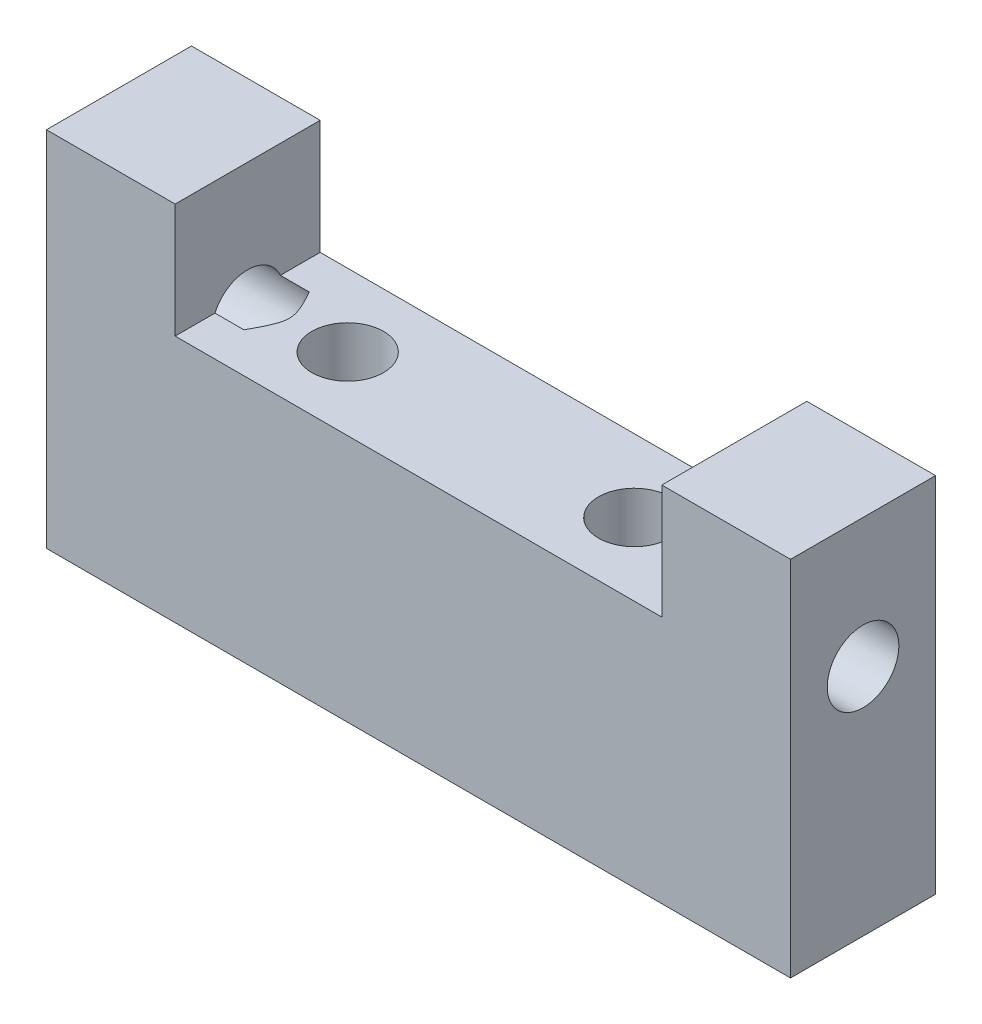
ISO-10303-21;
HEADER;
FILE_DESCRIPTION(('STEP AP214'),'2;1');
FILE_NAME('part.step','',(''),(''),'','','');
FILE_SCHEMA(('AUTOMOTIVE_DESIGN { 1 0 10303 214 1 1 1 1 }'));
ENDSEC;
DATA;
#1=APPLICATION_CONTEXT('core data for automotive mechanical design processes');
#2=APPLICATION_PROTOCOL_DEFINITION('international standard','automotive_design',2000,#1);
#3=PRODUCT_CONTEXT('',#1,'mechanical');
#4=PRODUCT('Part','Part','',(#3));
#5=PRODUCT_RELATED_PRODUCT_CATEGORY('part','',(#4));
#6=PRODUCT_DEFINITION_FORMATION('','',#4);
#7=PRODUCT_DEFINITION_CONTEXT('part definition',#1,'design');
#8=PRODUCT_DEFINITION('design','',#6,#7);
#9=PRODUCT_DEFINITION_SHAPE('','',#8);
#10=(LENGTH_UNIT() NAMED_UNIT(*) SI_UNIT(.MILLI.,.METRE.));
#11=(NAMED_UNIT(*) PLANE_ANGLE_UNIT() SI_UNIT($,.RADIAN.));
#12=(NAMED_UNIT(*) SI_UNIT($,.STERADIAN.) SOLID_ANGLE_UNIT());
#13=UNCERTAINTY_MEASURE_WITH_UNIT(LENGTH_MEASURE(1.E-05),#10,'distance_accuracy_value','');
#14=(GEOMETRIC_REPRESENTATION_CONTEXT(3) GLOBAL_UNCERTAINTY_ASSIGNED_CONTEXT((#13)) GLOBAL_UNIT_ASSIGNED_CONTEXT((#10,
#11,#12)) REPRESENTATION_CONTEXT('',''));
#15=CARTESIAN_POINT('',(0.,0.,0.));
#16=DIRECTION('',(0.,0.,1.));
#17=DIRECTION('',(1.,0.,0.));
#18=AXIS2_PLACEMENT_3D('',#15,#16,#17);
#19=CARTESIAN_POINT('',(-12.98,6.325,-5.06));
#20=DIRECTION('',(0.,1.,0.));
#21=DIRECTION('',(0.,0.,1.));
#22=AXIS2_PLACEMENT_3D('',#19,#20,#21);
#23=PLANE('',#22);
#24=DIRECTION('',(-1.,0.,0.));
#25=VECTOR('',#24,1.);
#26=CARTESIAN_POINT('',(-12.98,6.325,-5.06));
#27=LINE('',#26,#25);
#28=CARTESIAN_POINT('',(12.98,6.325,-5.06));
#29=VERTEX_POINT('',#28);
#30=CARTESIAN_POINT('',(8.49,6.325,-5.06));
#31=VERTEX_POINT('',#30);
#32=EDGE_CURVE('E185',#29,#31,#27,.T.);
#33=ORIENTED_EDGE('',*,*,#32,.T.);
#34=DIRECTION('',(0.,0.,1.));
#35=VECTOR('',#34,1.);
#36=CARTESIAN_POINT('',(8.49,6.325,-5.06));
#37=LINE('',#36,#35);
#38=CARTESIAN_POINT('',(8.49,6.325,0.));
#39=VERTEX_POINT('',#38);
#40=EDGE_CURVE('E176',#31,#39,#37,.T.);
#41=ORIENTED_EDGE('',*,*,#40,.T.);
#42=DIRECTION('',(-1.,0.,0.));
#43=VECTOR('',#42,1.);
#44=CARTESIAN_POINT('',(-12.98,6.325,0.));
#45=LINE('',#44,#43);
#46=CARTESIAN_POINT('',(12.98,6.325,0.));
#47=VERTEX_POINT('',#46);
#48=EDGE_CURVE('E202',#47,#39,#45,.T.);
#49=ORIENTED_EDGE('',*,*,#48,.F.);
#50=DIRECTION('',(0.,0.,1.));
#51=VECTOR('',#50,1.);
#52=CARTESIAN_POINT('',(12.98,6.325,-5.06));
#53=LINE('',#52,#51);
#54=EDGE_CURVE('E197',#29,#47,#53,.T.);
#55=ORIENTED_EDGE('',*,*,#54,.F.);
#56=EDGE_LOOP('',(#33,#41,#49,#55));
#57=FACE_BOUND('',#56,.T.);
#58=ADVANCED_FACE('F38',(#57),#23,.T.);
#59=CARTESIAN_POINT('',(12.98,-6.325,-5.06));
#60=DIRECTION('',(1.,0.,0.));
#61=DIRECTION('',(0.,0.,-1.));
#62=AXIS2_PLACEMENT_3D('',#59,#60,#61);
#63=PLANE('',#62);
#64=CARTESIAN_POINT('',(12.98,1.825,-2.53));
#65=DIRECTION('',(1.,0.,0.));
#66=DIRECTION('',(0.,0.,-1.));
#67=AXIS2_PLACEMENT_3D('',#64,#65,#66);
#68=CIRCLE('',#67,1.24999999999999);
#69=CARTESIAN_POINT('',(12.98,1.825,-3.77999999999999));
#70=VERTEX_POINT('',#69);
#71=EDGE_CURVE('E301',#70,#70,#68,.T.);
#72=ORIENTED_EDGE('',*,*,#71,.F.);
#73=EDGE_LOOP('',(#72));
#74=FACE_BOUND('',#73,.T.);
#75=DIRECTION('',(0.,1.,0.));
#76=VECTOR('',#75,1.);
#77=CARTESIAN_POINT('',(12.98,-6.325,0.));
#78=LINE('',#77,#76);
#79=CARTESIAN_POINT('',(12.98,-6.325,0.));
#80=VERTEX_POINT('',#79);
#81=EDGE_CURVE('E198',#80,#47,#78,.T.);
#82=ORIENTED_EDGE('',*,*,#81,.F.);
#83=DIRECTION('',(0.,0.,1.));
#84=VECTOR('',#83,1.);
#85=CARTESIAN_POINT('',(12.98,-6.325,-5.06));
#86=LINE('',#85,#84);
#87=CARTESIAN_POINT('',(12.98,-6.325,-5.06));
#88=VERTEX_POINT('',#87);
#89=EDGE_CURVE('E210',#88,#80,#86,.T.);
#90=ORIENTED_EDGE('',*,*,#89,.F.);
#91=DIRECTION('',(0.,1.,0.));
#92=VECTOR('',#91,1.);
#93=CARTESIAN_POINT('',(12.98,-6.325,-5.06));
#94=LINE('',#93,#92);
#95=EDGE_CURVE('E186',#88,#29,#94,.T.);
#96=ORIENTED_EDGE('',*,*,#95,.T.);
#97=ORIENTED_EDGE('',*,*,#54,.T.);
#98=EDGE_LOOP('',(#82,#90,#96,#97));
#99=FACE_BOUND('',#98,.T.);
#100=ADVANCED_FACE('F40',(#74,#99),#63,.T.);
#101=CARTESIAN_POINT('',(-12.98,-6.325,-5.06));
#102=DIRECTION('',(0.,-1.,0.));
#103=DIRECTION('',(0.,0.,-1.));
#104=AXIS2_PLACEMENT_3D('',#101,#102,#103);
#105=PLANE('',#104);
#106=CARTESIAN_POINT('',(-5.,-6.325,-2.53));
#107=DIRECTION('',(0.,1.,0.));
#108=DIRECTION('',(0.,0.,1.));
#109=AXIS2_PLACEMENT_3D('',#106,#107,#108);
#110=CIRCLE('',#109,1.25);
#111=CARTESIAN_POINT('',(-5.,-6.325,-1.28));
#112=VERTEX_POINT('',#111);
#113=EDGE_CURVE('E287',#112,#112,#110,.T.);
#114=ORIENTED_EDGE('',*,*,#113,.T.);
#115=EDGE_LOOP('',(#114));
#116=FACE_BOUND('',#115,.T.);
#117=CARTESIAN_POINT('',(5.,-6.325,-2.53));
#118=DIRECTION('',(0.,1.,0.));
#119=DIRECTION('',(0.,0.,1.));
#120=AXIS2_PLACEMENT_3D('',#117,#118,#119);
#121=CIRCLE('',#120,1.25);
#122=CARTESIAN_POINT('',(5.,-6.325,-1.28));
#123=VERTEX_POINT('',#122);
#124=EDGE_CURVE('E278',#123,#123,#121,.T.);
#125=ORIENTED_EDGE('',*,*,#124,.T.);
#126=EDGE_LOOP('',(#125));
#127=FACE_BOUND('',#126,.T.);
#128=DIRECTION('',(1.,0.,0.));
#129=VECTOR('',#128,1.);
#130=CARTESIAN_POINT('',(-12.98,-6.325,0.));
#131=LINE('',#130,#129);
#132=CARTESIAN_POINT('',(-12.98,-6.325,0.));
#133=VERTEX_POINT('',#132);
#134=EDGE_CURVE('E189',#133,#80,#131,.T.);
#135=ORIENTED_EDGE('',*,*,#134,.F.);
#136=DIRECTION('',(0.,0.,1.));
#137=VECTOR('',#136,1.);
#138=CARTESIAN_POINT('',(-12.98,-6.325,-5.06));
#139=LINE('',#138,#137);
#140=CARTESIAN_POINT('',(-12.98,-6.325,-5.06));
#141=VERTEX_POINT('',#140);
#142=EDGE_CURVE('E213',#141,#133,#139,.T.);
#143=ORIENTED_EDGE('',*,*,#142,.F.);
#144=DIRECTION('',(1.,0.,0.));
#145=VECTOR('',#144,1.);
#146=CARTESIAN_POINT('',(-12.98,-6.325,-5.06));
#147=LINE('',#146,#145);
#148=EDGE_CURVE('E194',#141,#88,#147,.T.);
#149=ORIENTED_EDGE('',*,*,#148,.T.);
#150=ORIENTED_EDGE('',*,*,#89,.T.);
#151=EDGE_LOOP('',(#135,#143,#149,#150));
#152=FACE_BOUND('',#151,.T.);
#153=ADVANCED_FACE('F148',(#116,#127,#152),#105,.T.);
#154=CARTESIAN_POINT('',(-12.98,-6.325,-5.06));
#155=DIRECTION('',(-1.,0.,0.));
#156=DIRECTION('',(0.,0.,1.));
#157=AXIS2_PLACEMENT_3D('',#154,#155,#156);
#158=PLANE('',#157);
#159=CARTESIAN_POINT('',(-12.98,1.825,-2.53));
#160=DIRECTION('',(-1.,0.,0.));
#161=DIRECTION('',(0.,0.,1.));
#162=AXIS2_PLACEMENT_3D('',#159,#160,#161);
#163=CIRCLE('',#162,1.24999999999999);
#164=CARTESIAN_POINT('',(-12.98,1.825,-1.28000000000001));
#165=VERTEX_POINT('',#164);
#166=EDGE_CURVE('E297',#165,#165,#163,.T.);
#167=ORIENTED_EDGE('',*,*,#166,.F.);
#168=EDGE_LOOP('',(#167));
#169=FACE_BOUND('',#168,.T.);
#170=DIRECTION('',(0.,-1.,0.));
#171=VECTOR('',#170,1.);
#172=CARTESIAN_POINT('',(-12.98,-6.325,0.));
#173=LINE('',#172,#171);
#174=CARTESIAN_POINT('',(-12.98,6.325,0.));
#175=VERTEX_POINT('',#174);
#176=EDGE_CURVE('E205',#175,#133,#173,.T.);
#177=ORIENTED_EDGE('',*,*,#176,.F.);
#178=DIRECTION('',(0.,0.,1.));
#179=VECTOR('',#178,1.);
#180=CARTESIAN_POINT('',(-12.98,6.325,-5.06));
#181=LINE('',#180,#179);
#182=CARTESIAN_POINT('',(-12.98,6.325,-5.06));
#183=VERTEX_POINT('',#182);
#184=EDGE_CURVE('E215',#183,#175,#181,.T.);
#185=ORIENTED_EDGE('',*,*,#184,.F.);
#186=DIRECTION('',(0.,-1.,0.));
#187=VECTOR('',#186,1.);
#188=CARTESIAN_POINT('',(-12.98,-6.325,-5.06));
#189=LINE('',#188,#187);
#190=EDGE_CURVE('E184',#183,#141,#189,.T.);
#191=ORIENTED_EDGE('',*,*,#190,.T.);
#192=ORIENTED_EDGE('',*,*,#142,.T.);
#193=EDGE_LOOP('',(#177,#185,#191,#192));
#194=FACE_BOUND('',#193,.T.);
#195=ADVANCED_FACE('F154',(#169,#194),#158,.T.);
#196=DIRECTION('',(0.,0.,1.));
#197=VECTOR('',#196,1.);
#198=CARTESIAN_POINT('',(-8.49,6.325,-5.06));
#199=LINE('',#198,#197);
#200=CARTESIAN_POINT('',(-8.49,6.325,-5.06));
#201=VERTEX_POINT('',#200);
#202=CARTESIAN_POINT('',(-8.49,6.325,0.));
#203=VERTEX_POINT('',#202);
#204=EDGE_CURVE('E166',#201,#203,#199,.T.);
#205=ORIENTED_EDGE('',*,*,#204,.F.);
#206=EDGE_CURVE('E169',#201,#183,#27,.T.);
#207=ORIENTED_EDGE('',*,*,#206,.T.);
#208=ORIENTED_EDGE('',*,*,#184,.T.);
#209=EDGE_CURVE('E171',#203,#175,#45,.T.);
#210=ORIENTED_EDGE('',*,*,#209,.F.);
#211=EDGE_LOOP('',(#205,#207,#208,#210));
#212=FACE_BOUND('',#211,.T.);
#213=ADVANCED_FACE('F144',(#212),#23,.T.);
#214=CARTESIAN_POINT('',(0.,0.,-5.06));
#215=DIRECTION('',(0.,0.,-1.));
#216=DIRECTION('',(-1.,0.,0.));
#217=AXIS2_PLACEMENT_3D('',#214,#215,#216);
#218=PLANE('',#217);
#219=DIRECTION('',(0.,-1.,0.));
#220=VECTOR('',#219,1.);
#221=CARTESIAN_POINT('',(-8.49,0.,-5.06));
#222=LINE('',#221,#220);
#223=CARTESIAN_POINT('',(-8.49,2.335,-5.06));
#224=VERTEX_POINT('',#223);
#225=EDGE_CURVE('E181',#201,#224,#222,.T.);
#226=ORIENTED_EDGE('',*,*,#225,.T.);
#227=DIRECTION('',(1.,0.,0.));
#228=VECTOR('',#227,1.);
#229=CARTESIAN_POINT('',(0.,2.335,-5.06));
#230=LINE('',#229,#228);
#231=CARTESIAN_POINT('',(8.49,2.335,-5.06));
#232=VERTEX_POINT('',#231);
#233=EDGE_CURVE('E275',#224,#232,#230,.T.);
#234=ORIENTED_EDGE('',*,*,#233,.T.);
#235=DIRECTION('',(0.,-1.,0.));
#236=VECTOR('',#235,1.);
#237=CARTESIAN_POINT('',(8.49,0.,-5.06));
#238=LINE('',#237,#236);
#239=EDGE_CURVE('E266',#31,#232,#238,.T.);
#240=ORIENTED_EDGE('',*,*,#239,.F.);
#241=ORIENTED_EDGE('',*,*,#32,.F.);
#242=ORIENTED_EDGE('',*,*,#95,.F.);
#243=ORIENTED_EDGE('',*,*,#148,.F.);
#244=ORIENTED_EDGE('',*,*,#190,.F.);
#245=ORIENTED_EDGE('',*,*,#206,.F.);
#246=EDGE_LOOP('',(#226,#234,#240,#241,#242,#243,#244,#245));
#247=FACE_BOUND('',#246,.T.);
#248=ADVANCED_FACE('F153',(#247),#218,.T.);
#249=CARTESIAN_POINT('',(0.,0.,0.));
#250=DIRECTION('',(0.,0.,-1.));
#251=DIRECTION('',(-1.,0.,0.));
#252=AXIS2_PLACEMENT_3D('',#249,#250,#251);
#253=PLANE('',#252);
#254=DIRECTION('',(1.,0.,0.));
#255=VECTOR('',#254,1.);
#256=CARTESIAN_POINT('',(0.,2.335,0.));
#257=LINE('',#256,#255);
#258=CARTESIAN_POINT('',(-8.49,2.335,0.));
#259=VERTEX_POINT('',#258);
#260=CARTESIAN_POINT('',(8.49,2.335,0.));
#261=VERTEX_POINT('',#260);
#262=EDGE_CURVE('E264',#259,#261,#257,.T.);
#263=ORIENTED_EDGE('',*,*,#262,.F.);
#264=DIRECTION('',(0.,-1.,0.));
#265=VECTOR('',#264,1.);
#266=CARTESIAN_POINT('',(-8.49,0.,0.));
#267=LINE('',#266,#265);
#268=EDGE_CURVE('E273',#203,#259,#267,.T.);
#269=ORIENTED_EDGE('',*,*,#268,.F.);
#270=ORIENTED_EDGE('',*,*,#209,.T.);
#271=ORIENTED_EDGE('',*,*,#176,.T.);
#272=ORIENTED_EDGE('',*,*,#134,.T.);
#273=ORIENTED_EDGE('',*,*,#81,.T.);
#274=ORIENTED_EDGE('',*,*,#48,.T.);
#275=DIRECTION('',(0.,-1.,0.));
#276=VECTOR('',#275,1.);
#277=CARTESIAN_POINT('',(8.49,0.,0.));
#278=LINE('',#277,#276);
#279=EDGE_CURVE('E276',#39,#261,#278,.T.);
#280=ORIENTED_EDGE('',*,*,#279,.T.);
#281=EDGE_LOOP('',(#263,#269,#270,#271,#272,#273,#274,#280));
#282=FACE_BOUND('',#281,.T.);
#283=ADVANCED_FACE('F160',(#282),#253,.F.);
#284=CARTESIAN_POINT('',(0.,2.335,-5.06));
#285=DIRECTION('',(0.,-1.,0.));
#286=DIRECTION('',(1.,0.,0.));
#287=AXIS2_PLACEMENT_3D('',#284,#285,#286);
#288=PLANE('',#287);
#289=CARTESIAN_POINT('',(-5.,2.335,-2.53));
#290=DIRECTION('',(0.,1.,0.));
#291=DIRECTION('',(0.,0.,1.));
#292=AXIS2_PLACEMENT_3D('',#289,#290,#291);
#293=CIRCLE('',#292,1.24999999999999);
#294=CARTESIAN_POINT('',(-5.,2.335,-1.28000000000001));
#295=VERTEX_POINT('',#294);
#296=EDGE_CURVE('E290',#295,#295,#293,.T.);
#297=ORIENTED_EDGE('',*,*,#296,.F.);
#298=EDGE_LOOP('',(#297));
#299=FACE_BOUND('',#298,.T.);
#300=CARTESIAN_POINT('',(5.,2.335,-2.53));
#301=DIRECTION('',(0.,1.,0.));
#302=DIRECTION('',(0.,0.,1.));
#303=AXIS2_PLACEMENT_3D('',#300,#301,#302);
#304=CIRCLE('',#303,1.24999999999999);
#305=CARTESIAN_POINT('',(5.,2.335,-1.28000000000001));
#306=VERTEX_POINT('',#305);
#307=EDGE_CURVE('E284',#306,#306,#304,.T.);
#308=ORIENTED_EDGE('',*,*,#307,.F.);
#309=EDGE_LOOP('',(#308));
#310=FACE_BOUND('',#309,.T.);
#311=CARTESIAN_POINT('',(10.6006135505171,2.335,-8.95335849479521));
#312=CARTESIAN_POINT('',(10.4656330208556,2.335,-8.7280000318139));
#313=CARTESIAN_POINT('',(10.3306801388875,2.335,-8.5026249853702));
#314=CARTESIAN_POINT('',(10.0608624571411,2.335,-8.05181198438698));
#315=CARTESIAN_POINT('',(9.92599766044514,2.335,-7.82637402800277));
#316=CARTESIAN_POINT('',(9.65628381622153,2.335,-7.37522959507365));
#317=CARTESIAN_POINT('',(9.52143487867379,2.335,-7.14952305277102));
#318=CARTESIAN_POINT('',(9.25193985522591,2.335,-6.69799875995295));
#319=CARTESIAN_POINT('',(9.11729376289112,2.335,-6.47218101328006));
#320=CARTESIAN_POINT('',(8.85008045404644,2.335,-6.02329438750343));
#321=CARTESIAN_POINT('',(8.71750900826047,2.335,-5.80022802611909));
#322=CARTESIAN_POINT('',(8.45290564342745,2.335,-5.35374635867383));
#323=CARTESIAN_POINT('',(8.3208737765473,2.335,-5.13033102163092));
#324=CARTESIAN_POINT('',(8.12373441537233,2.335,-4.79475569407397));
#325=CARTESIAN_POINT('',(8.05819044308426,2.335,-4.68285242748778));
#326=CARTESIAN_POINT('',(7.92756448372692,2.335,-4.45877117121353));
#327=CARTESIAN_POINT('',(7.86248251314938,2.335,-4.34659317190886));
#328=CARTESIAN_POINT('',(7.73308559162308,2.335,-4.12181954441342));
#329=CARTESIAN_POINT('',(7.66877050823489,2.335,-4.00922399286849));
#330=CARTESIAN_POINT('',(7.57336729660772,2.335,-3.83973226345923));
#331=CARTESIAN_POINT('',(7.54174535222359,2.335,-3.78313691654289));
#332=CARTESIAN_POINT('',(7.47901971478163,2.335,-3.66966009928968));
#333=CARTESIAN_POINT('',(7.44791601081011,2.335,-3.61277863501111));
#334=CARTESIAN_POINT('',(7.40457967397656,2.335,-3.53222834726727));
#335=CARTESIAN_POINT('',(7.39202396873685,2.335,-3.50873343028213));
#336=CARTESIAN_POINT('',(7.36707250376512,2.335,-3.46165874437874));
#337=CARTESIAN_POINT('',(7.35467674497718,2.335,-3.43807897496071));
#338=CARTESIAN_POINT('',(7.31777123476925,2.335,-3.36718189214905));
#339=CARTESIAN_POINT('',(7.29354737708401,2.335,-3.31971443005879));
#340=CARTESIAN_POINT('',(7.24606827736166,2.335,-3.22383093561331));
#341=CARTESIAN_POINT('',(7.22282212366067,2.335,-3.17541038325761));
#342=CARTESIAN_POINT('',(7.17819441582883,2.335,-3.07771296421728));
#343=CARTESIAN_POINT('',(7.15681233920172,2.335,-3.02843634216131));
#344=CARTESIAN_POINT('',(7.12532822828306,2.335,-2.94907348421327));
#345=CARTESIAN_POINT('',(7.11419498836263,2.335,-2.91940016276579));
#346=CARTESIAN_POINT('',(7.09346055924484,2.335,-2.85950586031741));
#347=CARTESIAN_POINT('',(7.08385973398007,2.335,-2.82928475111461));
#348=CARTESIAN_POINT('',(7.06687494259349,2.335,-2.76864618009619));
#349=CARTESIAN_POINT('',(7.05946312340919,2.335,-2.73823670985356));
#350=CARTESIAN_POINT('',(7.04734767337609,2.335,-2.67689452265079));
#351=CARTESIAN_POINT('',(7.04264148205851,2.335,-2.64596232900746));
#352=CARTESIAN_POINT('',(7.03644887093747,2.335,-2.58312672750252));
#353=CARTESIAN_POINT('',(7.03502981632074,2.335,-2.55121635622923));
#354=CARTESIAN_POINT('',(7.03583055393669,2.335,-2.48744610486289));
#355=CARTESIAN_POINT('',(7.0380500973172,2.335,-2.45558622146601));
#356=CARTESIAN_POINT('',(7.04583873765088,2.335,-2.39188445441659));
#357=CARTESIAN_POINT('',(7.05145013239373,2.335,-2.36004796733385));
#358=CARTESIAN_POINT('',(7.06537353833533,2.335,-2.29697259534885));
#359=CARTESIAN_POINT('',(7.07368718665399,2.335,-2.26573408490076));
#360=CARTESIAN_POINT('',(7.09686885182897,2.335,-2.18869383750192));
#361=CARTESIAN_POINT('',(7.11295156361642,2.335,-2.14326492176607));
#362=CARTESIAN_POINT('',(7.1478213787504,2.335,-2.05344313632576));
#363=CARTESIAN_POINT('',(7.16661130355831,2.335,-2.00905140437768));
#364=CARTESIAN_POINT('',(7.20591948585691,2.335,-1.92092300044736));
#365=CARTESIAN_POINT('',(7.22644168599238,2.335,-1.87718810502506));
#366=CARTESIAN_POINT('',(7.26858835443099,2.335,-1.79025005796696));
#367=CARTESIAN_POINT('',(7.29021298821699,2.335,-1.7470469873772));
#368=CARTESIAN_POINT('',(7.3566171858697,2.335,-1.61713288648874));
#369=CARTESIAN_POINT('',(7.40251470792591,2.335,-1.53099604764083));
#370=CARTESIAN_POINT('',(7.49568645909665,2.335,-1.35968937147186));
#371=CARTESIAN_POINT('',(7.54295797922098,2.335,-1.27451803790733));
#372=CARTESIAN_POINT('',(7.64369918136786,2.335,-1.09512648249607));
#373=CARTESIAN_POINT('',(7.69726940044238,2.335,-1.00096273428437));
#374=CARTESIAN_POINT('',(7.80502664442947,2.335,-0.812989631799009));
#375=CARTESIAN_POINT('',(7.8592136729818,2.335,-0.719180279620984));
#376=CARTESIAN_POINT('',(8.02235770325339,2.335,-0.438077889905791));
#377=CARTESIAN_POINT('',(8.13189211330444,2.335,-0.251120241531026));
#378=CARTESIAN_POINT('',(8.35177849015908,2.335,0.122552055003005));
#379=CARTESIAN_POINT('',(8.46213113712104,2.335,0.309266301287189));
#380=CARTESIAN_POINT('',(8.68324197588868,2.335,0.682448185692054));
#381=CARTESIAN_POINT('',(8.79400015733807,2.335,0.868915829947043));
#382=CARTESIAN_POINT('',(9.0085741297637,2.335,1.22961916153657));
#383=CARTESIAN_POINT('',(9.11237444301397,2.335,1.40386406531415));
#384=CARTESIAN_POINT('',(9.32012203548206,2.335,1.7522682059611));
#385=CARTESIAN_POINT('',(9.42406931591591,2.335,1.92642744210537));
#386=CARTESIAN_POINT('',(9.63195890829919,2.335,2.27450617419502));
#387=CARTESIAN_POINT('',(9.73590111565175,2.335,2.44842573262698));
#388=CARTESIAN_POINT('',(9.94386063579713,2.335,2.79621786956593));
#389=CARTESIAN_POINT('',(10.0478779479222,2.335,2.9700904484722));
#390=CARTESIAN_POINT('',(10.1519204485496,2.335,3.14394794130093));
#391=B_SPLINE_CURVE_WITH_KNOTS('',3,(#311,#312,#313,#314,#315,#316,#317,#318,#319,#320,#321,
#322,#323,#324,#325,#326,#327,#328,#329,#330,#331,#332,#333,#334,#335,#336,#337,#338,#339,#340,
#341,#342,#343,#344,#345,#346,#347,#348,#349,#350,#351,#352,#353,#354,#355,#356,#357,#358,#359,
#360,#361,#362,#363,#364,#365,#366,#367,#368,#369,#370,#371,#372,#373,#374,#375,#376,#377,#378,
#379,#380,#381,#382,#383,#384,#385,#386,#387,#388,#389,#390),.UNSPECIFIED.,.F.,.F.,(4,2,2,2,2,2,
2,2,2,2,2,2,2,2,2,2,2,2,2,2,2,2,2,2,2,2,2,2,2,2,2,2,2,2,2,2,2,2,2,4),(0.,0.788070853219018,
1.57616794535712,2.36493219144915,3.1536708660807,3.93213330116551,4.71066929782602,
5.09972526474529,5.48879505037015,5.87779664206031,6.07228629482726,6.26677184662111,
6.34668942617385,6.42660747722818,6.58646959096869,6.74758567039693,6.90865644319871,
7.0037066323289,7.09877936141271,7.19258436906661,7.28630045767686,7.38192075368026,
7.47753451026234,7.57436594261484,7.67125614852803,7.81567342699079,7.96024232096081,
8.10514961475513,8.25007872454223,8.54284798219729,8.8350746706821,9.16007613922927,
9.48507952658514,10.1351198644645,10.7857802321362,11.4364240979491,12.04488285109,
12.6533466685333,13.2611854090272,13.8690188099686),.UNSPECIFIED.);
#392=CARTESIAN_POINT('',(7.48,2.335,-1.38877259058503));
#393=VERTEX_POINT('',#392);
#394=CARTESIAN_POINT('',(7.48,2.335,-3.67122740941497));
#395=VERTEX_POINT('',#394);
#396=EDGE_CURVE('E315',#393,#395,#391,.F.);
#397=ORIENTED_EDGE('',*,*,#396,.T.);
#398=DIRECTION('',(1.,0.,0.));
#399=VECTOR('',#398,1.);
#400=CARTESIAN_POINT('',(12.98,2.335,-3.67122740941496));
#401=LINE('',#400,#399);
#402=CARTESIAN_POINT('',(8.49,2.335,-3.67122740941496));
#403=VERTEX_POINT('',#402);
#404=EDGE_CURVE('E46',#395,#403,#401,.T.);
#405=ORIENTED_EDGE('',*,*,#404,.T.);
#406=DIRECTION('',(0.,0.,1.));
#407=VECTOR('',#406,1.);
#408=CARTESIAN_POINT('',(8.49,2.335,-5.06));
#409=LINE('',#408,#407);
#410=EDGE_CURVE('E256',#232,#403,#409,.T.);
#411=ORIENTED_EDGE('',*,*,#410,.F.);
#412=ORIENTED_EDGE('',*,*,#233,.F.);
#413=DIRECTION('',(0.,0.,1.));
#414=VECTOR('',#413,1.);
#415=CARTESIAN_POINT('',(-8.49,2.335,-5.06));
#416=LINE('',#415,#414);
#417=CARTESIAN_POINT('',(-8.49,2.335,-3.67122740941496));
#418=VERTEX_POINT('',#417);
#419=EDGE_CURVE('E201',#224,#418,#416,.T.);
#420=ORIENTED_EDGE('',*,*,#419,.T.);
#421=DIRECTION('',(-1.,0.,0.));
#422=VECTOR('',#421,1.);
#423=CARTESIAN_POINT('',(-12.98,2.335,-3.67122740941496));
#424=LINE('',#423,#422);
#425=CARTESIAN_POINT('',(-7.48,2.335,-3.67122740941497));
#426=VERTEX_POINT('',#425);
#427=EDGE_CURVE('E225',#418,#426,#424,.F.);
#428=ORIENTED_EDGE('',*,*,#427,.T.);
#429=CARTESIAN_POINT('',(-10.600613581451,2.335,-8.95335854643974));
#430=CARTESIAN_POINT('',(-10.4656330497475,2.335,-8.72800008006056));
#431=CARTESIAN_POINT('',(-10.3306801657375,2.335,-8.50262503021895));
#432=CARTESIAN_POINT('',(-10.0608624799081,2.335,-8.05181202243929));
#433=CARTESIAN_POINT('',(-9.92599768117103,2.335,-7.82637406265656));
#434=CARTESIAN_POINT('',(-9.65628383286836,2.335,-7.37522962293231));
#435=CARTESIAN_POINT('',(-9.52143489328268,2.335,-7.14952307723308));
#436=CARTESIAN_POINT('',(-9.251939865762,2.335,-6.69799877762012));
#437=CARTESIAN_POINT('',(-9.11729377139235,2.335,-6.47218102754894));
#438=CARTESIAN_POINT('',(-8.85008046004885,2.335,-6.02329439759874));
#439=CARTESIAN_POINT('',(-8.71750901379515,2.335,-5.80022803544138));
#440=CARTESIAN_POINT('',(-8.45290564802591,2.335,-5.35374636645051));
#441=CARTESIAN_POINT('',(-8.32087378067727,2.335,-5.130331028635));
#442=CARTESIAN_POINT('',(-8.12373441879708,2.335,-4.79475569991639));
#443=CARTESIAN_POINT('',(-8.05819044627263,2.335,-4.68285243294095));
#444=CARTESIAN_POINT('',(-7.92756448644242,2.335,-4.4587711758882));
#445=CARTESIAN_POINT('',(-7.8624825156284,2.335,-4.34659317619428));
#446=CARTESIAN_POINT('',(-7.73308559362945,2.335,-4.12181954792005));
#447=CARTESIAN_POINT('',(-7.66877051000506,2.335,-4.00922399598558));
#448=CARTESIAN_POINT('',(-7.57336729802515,2.335,-3.839732265991));
#449=CARTESIAN_POINT('',(-7.5417453535237,2.335,-3.78313691887939));
#450=CARTESIAN_POINT('',(-7.4790197158482,2.335,-3.66966010123493));
#451=CARTESIAN_POINT('',(-7.44791601176046,2.335,-3.6127786367604));
#452=CARTESIAN_POINT('',(-7.40457967540347,2.335,-3.53222834992647));
#453=CARTESIAN_POINT('',(-7.39202397074888,2.335,-3.50873343405136));
#454=CARTESIAN_POINT('',(-7.36707250693025,2.335,-3.46165875037699));
#455=CARTESIAN_POINT('',(-7.3546767487103,2.335,-3.43807898207794));
#456=CARTESIAN_POINT('',(-7.31777124017502,2.335,-3.36718190264363));
#457=CARTESIAN_POINT('',(-7.29354738356141,2.335,-3.31971444282892));
#458=CARTESIAN_POINT('',(-7.24606828581091,2.335,-3.22383095299045));
#459=CARTESIAN_POINT('',(-7.22282213300979,2.335,-3.17541040296635));
#460=CARTESIAN_POINT('',(-7.17819442667044,2.335,-3.07771298871732));
#461=CARTESIAN_POINT('',(-7.15681235063621,2.335,-3.02843636912093));
#462=CARTESIAN_POINT('',(-7.12532823934299,2.335,-2.94907351318049));
#463=CARTESIAN_POINT('',(-7.11419499873638,2.335,-2.91940019118334));
#464=CARTESIAN_POINT('',(-7.09346056816422,2.335,-2.85950588763545));
#465=CARTESIAN_POINT('',(-7.08385974213131,2.335,-2.82928477788277));
#466=CARTESIAN_POINT('',(-7.06687494913504,2.335,-2.76864620574744));
#467=CARTESIAN_POINT('',(-7.05946312911054,2.335,-2.73823673493801));
#468=CARTESIAN_POINT('',(-7.04734767735142,2.335,-2.67689454654526));
#469=CARTESIAN_POINT('',(-7.04264148514801,2.335,-2.64596235227883));
#470=CARTESIAN_POINT('',(-7.03644887227752,2.335,-2.58312674930867));
#471=CARTESIAN_POINT('',(-7.03502981681028,2.335,-2.55121637719009));
#472=CARTESIAN_POINT('',(-7.0358305529426,2.335,-2.48744612405215));
#473=CARTESIAN_POINT('',(-7.03805009568927,2.335,-2.45558623972897));
#474=CARTESIAN_POINT('',(-7.04583873503207,2.335,-2.39188447080268));
#475=CARTESIAN_POINT('',(-7.05145012941987,2.335,-2.36004798276879));
#476=CARTESIAN_POINT('',(-7.06537353491018,2.335,-2.2969726088974));
#477=CARTESIAN_POINT('',(-7.07368718313329,2.335,-2.26573409751418));
#478=CARTESIAN_POINT('',(-7.09686884726656,2.335,-2.18869385129367));
#479=CARTESIAN_POINT('',(-7.11295155789251,2.335,-2.14326493759499));
#480=CARTESIAN_POINT('',(-7.14782137062535,2.335,-2.05344315617371));
#481=CARTESIAN_POINT('',(-7.16661129419342,2.335,-2.00905142620738));
#482=CARTESIAN_POINT('',(-7.20591947398689,2.335,-1.92092302622621));
#483=CARTESIAN_POINT('',(-7.22644167285685,2.335,-1.87718813277119));
#484=CARTESIAN_POINT('',(-7.26858833876407,2.335,-1.79025008963942));
#485=CARTESIAN_POINT('',(-7.29021297128417,2.335,-1.74704702100872));
#486=CARTESIAN_POINT('',(-7.35661716521357,2.335,-1.61713292585843));
#487=CARTESIAN_POINT('',(-7.40251468482801,2.335,-1.53099609079098));
#488=CARTESIAN_POINT('',(-7.49568643115469,2.335,-1.35968942218773));
#489=CARTESIAN_POINT('',(-7.54295794887668,2.335,-1.27451809240845));
#490=CARTESIAN_POINT('',(-7.64369914871667,2.335,-1.09512654011677));
#491=CARTESIAN_POINT('',(-7.69726936794357,2.335,-1.00096279127108));
#492=CARTESIAN_POINT('',(-7.80502661230144,2.335,-0.812989687554493));
#493=CARTESIAN_POINT('',(-7.85921364107217,2.335,-0.719180334779225));
#494=CARTESIAN_POINT('',(-8.02235767205267,2.335,-0.438077943300895));
#495=CARTESIAN_POINT('',(-8.1318920826471,2.335,-0.251120293790327));
#496=CARTESIAN_POINT('',(-8.3517784606394,2.335,0.122552004991055));
#497=CARTESIAN_POINT('',(-8.46213110819571,2.335,0.309266252386753));
#498=CARTESIAN_POINT('',(-8.68324194817507,2.335,0.68244813899991));
#499=CARTESIAN_POINT('',(-8.79400013024183,2.335,0.868915784351677));
#500=CARTESIAN_POINT('',(-9.00857410264066,2.335,1.22961911598459));
#501=CARTESIAN_POINT('',(-9.11237441524345,2.335,1.40386401871075));
#502=CARTESIAN_POINT('',(-9.32012200642003,2.335,1.75226815725316));
#503=CARTESIAN_POINT('',(-9.42406928620984,2.335,1.92642739234432));
#504=CARTESIAN_POINT('',(-9.63195887730511,2.335,2.27450612232317));
#505=CARTESIAN_POINT('',(-9.73590108401371,2.335,2.44842567969745));
#506=CARTESIAN_POINT('',(-9.94386060287244,2.335,2.79621781451992));
#507=CARTESIAN_POINT('',(-10.0478779143548,2.335,2.97009039236738));
#508=CARTESIAN_POINT('',(-10.15192041434,2.335,3.14394788413704));
#509=B_SPLINE_CURVE_WITH_KNOTS('',3,(#429,#430,#431,#432,#433,#434,#435,#436,#437,#438,#439,
#440,#441,#442,#443,#444,#445,#446,#447,#448,#449,#450,#451,#452,#453,#454,#455,#456,#457,#458,
#459,#460,#461,#462,#463,#464,#465,#466,#467,#468,#469,#470,#471,#472,#473,#474,#475,#476,#477,
#478,#479,#480,#481,#482,#483,#484,#485,#486,#487,#488,#489,#490,#491,#492,#493,#494,#495,#496,
#497,#498,#499,#500,#501,#502,#503,#504,#505,#506,#507,#508),.UNSPECIFIED.,.F.,.F.,(4,2,2,2,2,2,
2,2,2,2,2,2,2,2,2,2,2,2,2,2,2,2,2,2,2,2,2,2,2,2,2,2,2,2,2,2,2,2,2,4),(0.,0.788070865111665,
1.57616796914282,2.36493222711804,3.15367091363238,3.93213335142766,4.71066935079862,
5.09972531908394,5.48879510607487,5.87779669913122,6.07228635258128,6.26677190505816,
6.34668948084666,6.42660752813673,6.58646963433788,6.74758570629563,6.90865647164571,
7.00370666304667,7.09877939440653,7.19258440431647,7.28630049517812,7.38192079381638,
7.47753455301468,7.5743659879693,7.67125619650557,7.81567346805442,7.96024235509765,
8.10514964193608,8.25007874476712,8.54284798896568,8.83507466402352,9.16007613444875,
9.48507952368366,10.1351198653263,10.7857802367759,11.4364241063635,12.0448828558004,
12.6533466695406,13.2611854063197,13.8690188035454),.UNSPECIFIED.);
#510=CARTESIAN_POINT('',(-7.48,2.335,-1.38877259058503));
#511=VERTEX_POINT('',#510);
#512=EDGE_CURVE('E212',#426,#511,#509,.T.);
#513=ORIENTED_EDGE('',*,*,#512,.T.);
#514=DIRECTION('',(-1.,0.,0.));
#515=VECTOR('',#514,1.);
#516=CARTESIAN_POINT('',(-12.98,2.335,-1.38877259058504));
#517=LINE('',#516,#515);
#518=CARTESIAN_POINT('',(-8.49,2.335,-1.38877259058504));
#519=VERTEX_POINT('',#518);
#520=EDGE_CURVE('E321',#511,#519,#517,.T.);
#521=ORIENTED_EDGE('',*,*,#520,.T.);
#522=EDGE_CURVE('E175',#519,#259,#416,.T.);
#523=ORIENTED_EDGE('',*,*,#522,.T.);
#524=ORIENTED_EDGE('',*,*,#262,.T.);
#525=CARTESIAN_POINT('',(8.49,2.335,-1.38877259058504));
#526=VERTEX_POINT('',#525);
#527=EDGE_CURVE('E253',#526,#261,#409,.T.);
#528=ORIENTED_EDGE('',*,*,#527,.F.);
#529=DIRECTION('',(1.,0.,0.));
#530=VECTOR('',#529,1.);
#531=CARTESIAN_POINT('',(12.98,2.335,-1.38877259058504));
#532=LINE('',#531,#530);
#533=EDGE_CURVE('E262',#526,#393,#532,.F.);
#534=ORIENTED_EDGE('',*,*,#533,.T.);
#535=EDGE_LOOP('',(#397,#405,#411,#412,#420,#428,#513,#521,#523,#524,#528,#534));
#536=FACE_BOUND('',#535,.T.);
#537=ADVANCED_FACE('F227',(#299,#310,#536),#288,.F.);
#538=CARTESIAN_POINT('',(-8.49,0.,-5.06));
#539=DIRECTION('',(-1.,0.,0.));
#540=DIRECTION('',(0.,0.,1.));
#541=AXIS2_PLACEMENT_3D('',#538,#539,#540);
#542=PLANE('',#541);
#543=ORIENTED_EDGE('',*,*,#522,.F.);
#544=CARTESIAN_POINT('',(-8.49,1.825,-2.53));
#545=DIRECTION('',(-1.,0.,0.));
#546=DIRECTION('',(0.,0.,1.));
#547=AXIS2_PLACEMENT_3D('',#544,#545,#546);
#548=CIRCLE('',#547,1.24999999999999);
#549=EDGE_CURVE('E293',#519,#418,#548,.T.);
#550=ORIENTED_EDGE('',*,*,#549,.T.);
#551=ORIENTED_EDGE('',*,*,#419,.F.);
#552=ORIENTED_EDGE('',*,*,#225,.F.);
#553=ORIENTED_EDGE('',*,*,#204,.T.);
#554=ORIENTED_EDGE('',*,*,#268,.T.);
#555=EDGE_LOOP('',(#543,#550,#551,#552,#553,#554));
#556=FACE_BOUND('',#555,.T.);
#557=ADVANCED_FACE('F244',(#556),#542,.F.);
#558=CARTESIAN_POINT('',(8.49,0.,-5.06));
#559=DIRECTION('',(-1.,0.,0.));
#560=DIRECTION('',(0.,0.,1.));
#561=AXIS2_PLACEMENT_3D('',#558,#559,#560);
#562=PLANE('',#561);
#563=CARTESIAN_POINT('',(8.49,1.825,-2.53));
#564=DIRECTION('',(-1.,0.,0.));
#565=DIRECTION('',(0.,0.,1.));
#566=AXIS2_PLACEMENT_3D('',#563,#564,#565);
#567=CIRCLE('',#566,1.24999999999999);
#568=EDGE_CURVE('E11',#526,#403,#567,.T.);
#569=ORIENTED_EDGE('',*,*,#568,.F.);
#570=ORIENTED_EDGE('',*,*,#527,.T.);
#571=ORIENTED_EDGE('',*,*,#279,.F.);
#572=ORIENTED_EDGE('',*,*,#40,.F.);
#573=ORIENTED_EDGE('',*,*,#239,.T.);
#574=ORIENTED_EDGE('',*,*,#410,.T.);
#575=EDGE_LOOP('',(#569,#570,#571,#572,#573,#574));
#576=FACE_BOUND('',#575,.T.);
#577=ADVANCED_FACE('F242',(#576),#562,.T.);
#578=CARTESIAN_POINT('',(5.,2.335,-2.53));
#579=DIRECTION('',(0.,1.,0.));
#580=DIRECTION('',(0.,0.,1.));
#581=AXIS2_PLACEMENT_3D('',#578,#579,#580);
#582=CYLINDRICAL_SURFACE('',#581,1.24999999999999);
#583=ORIENTED_EDGE('',*,*,#124,.F.);
#584=EDGE_LOOP('',(#583));
#585=FACE_BOUND('',#584,.T.);
#586=ORIENTED_EDGE('',*,*,#307,.T.);
#587=EDGE_LOOP('',(#586));
#588=FACE_BOUND('',#587,.T.);
#589=ADVANCED_FACE('F238',(#585,#588),#582,.F.);
#590=CARTESIAN_POINT('',(-5.,2.335,-2.53));
#591=DIRECTION('',(0.,1.,0.));
#592=DIRECTION('',(0.,0.,1.));
#593=AXIS2_PLACEMENT_3D('',#590,#591,#592);
#594=CYLINDRICAL_SURFACE('',#593,1.24999999999999);
#595=ORIENTED_EDGE('',*,*,#113,.F.);
#596=EDGE_LOOP('',(#595));
#597=FACE_BOUND('',#596,.T.);
#598=ORIENTED_EDGE('',*,*,#296,.T.);
#599=EDGE_LOOP('',(#598));
#600=FACE_BOUND('',#599,.T.);
#601=ADVANCED_FACE('F235',(#597,#600),#594,.F.);
#602=CARTESIAN_POINT('',(-12.98,1.825,-2.53));
#603=DIRECTION('',(-1.,0.,0.));
#604=DIRECTION('',(0.,0.,1.));
#605=AXIS2_PLACEMENT_3D('',#602,#603,#604);
#606=CYLINDRICAL_SURFACE('',#605,1.24999999999999);
#607=ORIENTED_EDGE('',*,*,#166,.T.);
#608=EDGE_LOOP('',(#607));
#609=FACE_BOUND('',#608,.T.);
#610=CARTESIAN_POINT('',(-7.48,1.825,-2.53));
#611=DIRECTION('',(-1.,0.,0.));
#612=DIRECTION('',(0.,0.,1.));
#613=AXIS2_PLACEMENT_3D('',#610,#611,#612);
#614=CIRCLE('',#613,1.25);
#615=EDGE_CURVE('E59',#426,#511,#614,.T.);
#616=ORIENTED_EDGE('',*,*,#615,.F.);
#617=ORIENTED_EDGE('',*,*,#427,.F.);
#618=ORIENTED_EDGE('',*,*,#549,.F.);
#619=ORIENTED_EDGE('',*,*,#520,.F.);
#620=EDGE_LOOP('',(#616,#617,#618,#619));
#621=FACE_BOUND('',#620,.T.);
#622=ADVANCED_FACE('F233',(#609,#621),#606,.F.);
#623=CARTESIAN_POINT('',(-7.48,1.825,-2.53));
#624=DIRECTION('',(-1.,0.,0.));
#625=DIRECTION('',(0.,0.,1.));
#626=AXIS2_PLACEMENT_3D('',#623,#624,#625);
#627=CONICAL_SURFACE('',#626,1.25,1.02974425867665);
#628=CARTESIAN_POINT('',(-6.72892422621555,1.825,-2.53));
#629=VERTEX_POINT('',#628);
#630=VERTEX_LOOP('',#629);
#631=FACE_BOUND('',#630,.T.);
#632=ORIENTED_EDGE('',*,*,#615,.T.);
#633=ORIENTED_EDGE('',*,*,#512,.F.);
#634=EDGE_LOOP('',(#632,#633));
#635=FACE_BOUND('',#634,.T.);
#636=ADVANCED_FACE('F137',(#631,#635),#627,.F.);
#637=CARTESIAN_POINT('',(12.98,1.825,-2.53));
#638=DIRECTION('',(1.,0.,0.));
#639=DIRECTION('',(0.,0.,-1.));
#640=AXIS2_PLACEMENT_3D('',#637,#638,#639);
#641=CYLINDRICAL_SURFACE('',#640,1.24999999999999);
#642=ORIENTED_EDGE('',*,*,#71,.T.);
#643=EDGE_LOOP('',(#642));
#644=FACE_BOUND('',#643,.T.);
#645=CARTESIAN_POINT('',(7.48,1.825,-2.53));
#646=DIRECTION('',(1.,0.,0.));
#647=DIRECTION('',(0.,0.,-1.));
#648=AXIS2_PLACEMENT_3D('',#645,#646,#647);
#649=CIRCLE('',#648,1.25);
#650=EDGE_CURVE('E52',#393,#395,#649,.T.);
#651=ORIENTED_EDGE('',*,*,#650,.F.);
#652=ORIENTED_EDGE('',*,*,#533,.F.);
#653=ORIENTED_EDGE('',*,*,#568,.T.);
#654=ORIENTED_EDGE('',*,*,#404,.F.);
#655=EDGE_LOOP('',(#651,#652,#653,#654));
#656=FACE_BOUND('',#655,.T.);
#657=ADVANCED_FACE('F132',(#644,#656),#641,.F.);
#658=CARTESIAN_POINT('',(7.48,1.825,-2.53));
#659=DIRECTION('',(1.,0.,0.));
#660=DIRECTION('',(0.,0.,-1.));
#661=AXIS2_PLACEMENT_3D('',#658,#659,#660);
#662=CONICAL_SURFACE('',#661,1.25,1.02974425867665);
#663=CARTESIAN_POINT('',(6.72892422621555,1.825,-2.53));
#664=VERTEX_POINT('',#663);
#665=VERTEX_LOOP('',#664);
#666=FACE_BOUND('',#665,.T.);
#667=ORIENTED_EDGE('',*,*,#650,.T.);
#668=ORIENTED_EDGE('',*,*,#396,.F.);
#669=EDGE_LOOP('',(#667,#668));
#670=FACE_BOUND('',#669,.T.);
#671=ADVANCED_FACE('F130',(#666,#670),#662,.F.);
#672=CLOSED_SHELL('',(#58,#100,#153,#195,#213,#248,#283,#537,#557,#577,#589,#601,#622,#636,#657,#671));
#673=MANIFOLD_SOLID_BREP('B2',#672);
#674=ADVANCED_BREP_SHAPE_REPRESENTATION('',(#18,#673),#14);
#675=SHAPE_DEFINITION_REPRESENTATION(#9,#674);
ENDSEC;
END-ISO-10303-21;
